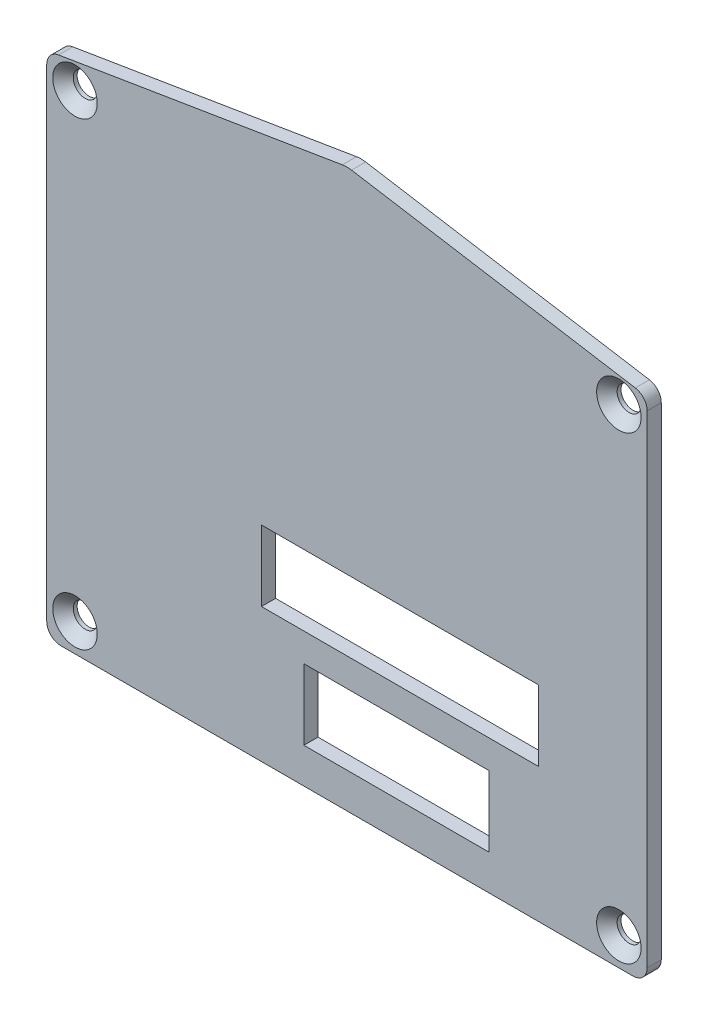
ISO-10303-21;
HEADER;
FILE_DESCRIPTION(('STEP AP214'),'2;1');
FILE_NAME('part.step','',(''),(''),'','','');
FILE_SCHEMA(('AUTOMOTIVE_DESIGN { 1 0 10303 214 1 1 1 1 }'));
ENDSEC;
DATA;
#1=APPLICATION_CONTEXT('core data for automotive mechanical design processes');
#2=APPLICATION_PROTOCOL_DEFINITION('international standard','automotive_design',2000,#1);
#3=PRODUCT_CONTEXT('',#1,'mechanical');
#4=PRODUCT('Part','Part','',(#3));
#5=PRODUCT_RELATED_PRODUCT_CATEGORY('part','',(#4));
#6=PRODUCT_DEFINITION_FORMATION('','',#4);
#7=PRODUCT_DEFINITION_CONTEXT('part definition',#1,'design');
#8=PRODUCT_DEFINITION('design','',#6,#7);
#9=PRODUCT_DEFINITION_SHAPE('','',#8);
#10=(LENGTH_UNIT() NAMED_UNIT(*) SI_UNIT(.MILLI.,.METRE.));
#11=(NAMED_UNIT(*) PLANE_ANGLE_UNIT() SI_UNIT($,.RADIAN.));
#12=(NAMED_UNIT(*) SI_UNIT($,.STERADIAN.) SOLID_ANGLE_UNIT());
#13=UNCERTAINTY_MEASURE_WITH_UNIT(LENGTH_MEASURE(1.E-05),#10,'distance_accuracy_value','');
#14=(GEOMETRIC_REPRESENTATION_CONTEXT(3) GLOBAL_UNCERTAINTY_ASSIGNED_CONTEXT((#13)) GLOBAL_UNIT_ASSIGNED_CONTEXT((#10,
#11,#12)) REPRESENTATION_CONTEXT('',''));
#15=CARTESIAN_POINT('',(0.,0.,0.));
#16=DIRECTION('',(0.,0.,1.));
#17=DIRECTION('',(1.,0.,0.));
#18=AXIS2_PLACEMENT_3D('',#15,#16,#17);
#19=CARTESIAN_POINT('',(-40.5,34.3024652654793,2.));
#20=DIRECTION('',(0.,0.,1.));
#21=DIRECTION('',(1.,0.,0.));
#22=AXIS2_PLACEMENT_3D('',#19,#20,#21);
#23=CYLINDRICAL_SURFACE('',#22,2.);
#24=DIRECTION('',(0.,0.,1.));
#25=VECTOR('',#24,1.);
#26=CARTESIAN_POINT('',(-40.8250325204258,36.2758769966357,2.));
#27=LINE('',#26,#25);
#28=CARTESIAN_POINT('',(-40.8250325204258,36.2758769966357,0.));
#29=VERTEX_POINT('',#28);
#30=CARTESIAN_POINT('',(-40.8250325204258,36.2758769966357,2.));
#31=VERTEX_POINT('',#30);
#32=EDGE_CURVE('E294',#29,#31,#27,.T.);
#33=ORIENTED_EDGE('',*,*,#32,.F.);
#34=CARTESIAN_POINT('',(-40.5,34.3024652654793,0.));
#35=DIRECTION('',(0.,0.,1.));
#36=DIRECTION('',(1.,0.,0.));
#37=AXIS2_PLACEMENT_3D('',#34,#35,#36);
#38=CIRCLE('',#37,2.);
#39=CARTESIAN_POINT('',(-42.5,34.3024652654793,0.));
#40=VERTEX_POINT('',#39);
#41=EDGE_CURVE('E42',#40,#29,#38,.F.);
#42=ORIENTED_EDGE('',*,*,#41,.F.);
#43=DIRECTION('',(0.,0.,1.));
#44=VECTOR('',#43,1.);
#45=CARTESIAN_POINT('',(-42.5,34.3024652654793,2.));
#46=LINE('',#45,#44);
#47=CARTESIAN_POINT('',(-42.5,34.3024652654793,2.));
#48=VERTEX_POINT('',#47);
#49=EDGE_CURVE('E297',#48,#40,#46,.F.);
#50=ORIENTED_EDGE('',*,*,#49,.F.);
#51=CARTESIAN_POINT('',(-40.5,34.3024652654793,2.));
#52=DIRECTION('',(0.,0.,1.));
#53=DIRECTION('',(1.,0.,0.));
#54=AXIS2_PLACEMENT_3D('',#51,#52,#53);
#55=CIRCLE('',#54,2.);
#56=EDGE_CURVE('E11',#31,#48,#55,.T.);
#57=ORIENTED_EDGE('',*,*,#56,.F.);
#58=EDGE_LOOP('',(#33,#42,#50,#57));
#59=FACE_BOUND('',#58,.T.);
#60=ADVANCED_FACE('F35',(#59),#23,.T.);
#61=CARTESIAN_POINT('',(-40.5,-34.,2.));
#62=DIRECTION('',(0.,0.,-1.));
#63=DIRECTION('',(-1.,0.,0.));
#64=AXIS2_PLACEMENT_3D('',#61,#62,#63);
#65=CYLINDRICAL_SURFACE('',#64,2.);
#66=DIRECTION('',(0.,0.,1.));
#67=VECTOR('',#66,1.);
#68=CARTESIAN_POINT('',(-42.5,-34.,2.));
#69=LINE('',#68,#67);
#70=CARTESIAN_POINT('',(-42.5,-34.,0.));
#71=VERTEX_POINT('',#70);
#72=CARTESIAN_POINT('',(-42.5,-34.,2.));
#73=VERTEX_POINT('',#72);
#74=EDGE_CURVE('E284',#71,#73,#69,.T.);
#75=ORIENTED_EDGE('',*,*,#74,.F.);
#76=CARTESIAN_POINT('',(-40.5,-34.,0.));
#77=DIRECTION('',(0.,0.,1.));
#78=DIRECTION('',(1.,0.,0.));
#79=AXIS2_PLACEMENT_3D('',#76,#77,#78);
#80=CIRCLE('',#79,2.);
#81=CARTESIAN_POINT('',(-40.5,-36.,0.));
#82=VERTEX_POINT('',#81);
#83=EDGE_CURVE('E290',#82,#71,#80,.F.);
#84=ORIENTED_EDGE('',*,*,#83,.F.);
#85=DIRECTION('',(0.,0.,1.));
#86=VECTOR('',#85,1.);
#87=CARTESIAN_POINT('',(-40.5,-36.,2.));
#88=LINE('',#87,#86);
#89=CARTESIAN_POINT('',(-40.5,-36.,2.));
#90=VERTEX_POINT('',#89);
#91=EDGE_CURVE('E287',#90,#82,#88,.F.);
#92=ORIENTED_EDGE('',*,*,#91,.F.);
#93=CARTESIAN_POINT('',(-40.5,-34.,2.));
#94=DIRECTION('',(0.,0.,1.));
#95=DIRECTION('',(1.,0.,0.));
#96=AXIS2_PLACEMENT_3D('',#93,#94,#95);
#97=CIRCLE('',#96,2.);
#98=EDGE_CURVE('E292',#73,#90,#97,.T.);
#99=ORIENTED_EDGE('',*,*,#98,.F.);
#100=EDGE_LOOP('',(#75,#84,#92,#99));
#101=FACE_BOUND('',#100,.T.);
#102=ADVANCED_FACE('F338',(#101),#65,.T.);
#103=CARTESIAN_POINT('',(40.5,-34.,2.));
#104=DIRECTION('',(0.,0.,-1.));
#105=DIRECTION('',(-1.,0.,0.));
#106=AXIS2_PLACEMENT_3D('',#103,#104,#105);
#107=CYLINDRICAL_SURFACE('',#106,2.);
#108=DIRECTION('',(0.,0.,-1.));
#109=VECTOR('',#108,1.);
#110=CARTESIAN_POINT('',(42.5,-34.,2.));
#111=LINE('',#110,#109);
#112=CARTESIAN_POINT('',(42.5,-34.,2.));
#113=VERTEX_POINT('',#112);
#114=CARTESIAN_POINT('',(42.5,-34.,0.));
#115=VERTEX_POINT('',#114);
#116=EDGE_CURVE('E273',#113,#115,#111,.T.);
#117=ORIENTED_EDGE('',*,*,#116,.F.);
#118=CARTESIAN_POINT('',(40.5,-34.,2.));
#119=DIRECTION('',(0.,0.,1.));
#120=DIRECTION('',(1.,0.,0.));
#121=AXIS2_PLACEMENT_3D('',#118,#119,#120);
#122=CIRCLE('',#121,2.);
#123=CARTESIAN_POINT('',(40.5,-36.,2.));
#124=VERTEX_POINT('',#123);
#125=EDGE_CURVE('E279',#124,#113,#122,.T.);
#126=ORIENTED_EDGE('',*,*,#125,.F.);
#127=DIRECTION('',(0.,0.,-1.));
#128=VECTOR('',#127,1.);
#129=CARTESIAN_POINT('',(40.5,-36.,2.));
#130=LINE('',#129,#128);
#131=CARTESIAN_POINT('',(40.5,-36.,0.));
#132=VERTEX_POINT('',#131);
#133=EDGE_CURVE('E276',#132,#124,#130,.F.);
#134=ORIENTED_EDGE('',*,*,#133,.F.);
#135=CARTESIAN_POINT('',(40.5,-34.,0.));
#136=DIRECTION('',(0.,0.,1.));
#137=DIRECTION('',(1.,0.,0.));
#138=AXIS2_PLACEMENT_3D('',#135,#136,#137);
#139=CIRCLE('',#138,2.);
#140=EDGE_CURVE('E281',#115,#132,#139,.F.);
#141=ORIENTED_EDGE('',*,*,#140,.F.);
#142=EDGE_LOOP('',(#117,#126,#134,#141));
#143=FACE_BOUND('',#142,.T.);
#144=ADVANCED_FACE('F331',(#143),#107,.T.);
#145=CARTESIAN_POINT('',(40.5,34.3024652654794,2.));
#146=DIRECTION('',(0.,0.,1.));
#147=DIRECTION('',(1.,0.,0.));
#148=AXIS2_PLACEMENT_3D('',#145,#146,#147);
#149=CYLINDRICAL_SURFACE('',#148,2.);
#150=DIRECTION('',(0.,0.,-1.));
#151=VECTOR('',#150,1.);
#152=CARTESIAN_POINT('',(40.8250325204258,36.2758769966358,2.));
#153=LINE('',#152,#151);
#154=CARTESIAN_POINT('',(40.8250325204258,36.2758769966358,2.));
#155=VERTEX_POINT('',#154);
#156=CARTESIAN_POINT('',(40.8250325204258,36.2758769966358,0.));
#157=VERTEX_POINT('',#156);
#158=EDGE_CURVE('E262',#155,#157,#153,.T.);
#159=ORIENTED_EDGE('',*,*,#158,.F.);
#160=CARTESIAN_POINT('',(40.5,34.3024652654794,2.));
#161=DIRECTION('',(0.,0.,1.));
#162=DIRECTION('',(1.,0.,0.));
#163=AXIS2_PLACEMENT_3D('',#160,#161,#162);
#164=CIRCLE('',#163,2.);
#165=CARTESIAN_POINT('',(42.5,34.3024652654794,2.));
#166=VERTEX_POINT('',#165);
#167=EDGE_CURVE('E268',#166,#155,#164,.T.);
#168=ORIENTED_EDGE('',*,*,#167,.F.);
#169=DIRECTION('',(0.,0.,-1.));
#170=VECTOR('',#169,1.);
#171=CARTESIAN_POINT('',(42.5,34.3024652654794,2.));
#172=LINE('',#171,#170);
#173=CARTESIAN_POINT('',(42.5,34.3024652654794,0.));
#174=VERTEX_POINT('',#173);
#175=EDGE_CURVE('E265',#174,#166,#172,.F.);
#176=ORIENTED_EDGE('',*,*,#175,.F.);
#177=CARTESIAN_POINT('',(40.5,34.3024652654794,0.));
#178=DIRECTION('',(0.,0.,1.));
#179=DIRECTION('',(1.,0.,0.));
#180=AXIS2_PLACEMENT_3D('',#177,#178,#179);
#181=CIRCLE('',#180,2.);
#182=EDGE_CURVE('E270',#157,#174,#181,.F.);
#183=ORIENTED_EDGE('',*,*,#182,.F.);
#184=EDGE_LOOP('',(#159,#168,#176,#183));
#185=FACE_BOUND('',#184,.T.);
#186=ADVANCED_FACE('F322',(#185),#149,.T.);
#187=CARTESIAN_POINT('',(0.,38.946107001547,2.));
#188=DIRECTION('',(0.,0.,1.));
#189=DIRECTION('',(1.,0.,0.));
#190=AXIS2_PLACEMENT_3D('',#187,#188,#189);
#191=CYLINDRICAL_SURFACE('',#190,4.);
#192=DIRECTION('',(0.,0.,1.));
#193=VECTOR('',#192,1.);
#194=CARTESIAN_POINT('',(0.650065040851534,42.8929304638597,2.));
#195=LINE('',#194,#193);
#196=CARTESIAN_POINT('',(0.650065040851547,42.8929304638597,0.));
#197=VERTEX_POINT('',#196);
#198=CARTESIAN_POINT('',(0.650065040851547,42.8929304638597,2.));
#199=VERTEX_POINT('',#198);
#200=EDGE_CURVE('E241',#197,#199,#195,.T.);
#201=ORIENTED_EDGE('',*,*,#200,.F.);
#202=CARTESIAN_POINT('',(0.,38.946107001547,0.));
#203=DIRECTION('',(0.,0.,1.));
#204=DIRECTION('',(1.,0.,0.));
#205=AXIS2_PLACEMENT_3D('',#202,#203,#204);
#206=CIRCLE('',#205,4.);
#207=CARTESIAN_POINT('',(-0.6500650408515,42.8929304638597,0.));
#208=VERTEX_POINT('',#207);
#209=EDGE_CURVE('E257',#208,#197,#206,.F.);
#210=ORIENTED_EDGE('',*,*,#209,.F.);
#211=DIRECTION('',(0.,0.,1.));
#212=VECTOR('',#211,1.);
#213=CARTESIAN_POINT('',(-0.650065040851502,42.8929304638597,2.));
#214=LINE('',#213,#212);
#215=CARTESIAN_POINT('',(-0.6500650408515,42.8929304638597,2.));
#216=VERTEX_POINT('',#215);
#217=EDGE_CURVE('E254',#216,#208,#214,.F.);
#218=ORIENTED_EDGE('',*,*,#217,.F.);
#219=CARTESIAN_POINT('',(0.,38.946107001547,2.));
#220=DIRECTION('',(0.,0.,1.));
#221=DIRECTION('',(1.,0.,0.));
#222=AXIS2_PLACEMENT_3D('',#219,#220,#221);
#223=CIRCLE('',#222,4.);
#224=EDGE_CURVE('E259',#199,#216,#223,.T.);
#225=ORIENTED_EDGE('',*,*,#224,.F.);
#226=EDGE_LOOP('',(#201,#210,#218,#225));
#227=FACE_BOUND('',#226,.T.);
#228=ADVANCED_FACE('F312',(#227),#191,.T.);
#229=CARTESIAN_POINT('',(0.,-36.,2.));
#230=DIRECTION('',(0.,1.,0.));
#231=DIRECTION('',(0.,0.,1.));
#232=AXIS2_PLACEMENT_3D('',#229,#230,#231);
#233=PLANE('',#232);
#234=DIRECTION('',(1.,0.,0.));
#235=VECTOR('',#234,1.);
#236=CARTESIAN_POINT('',(0.,-36.,2.));
#237=LINE('',#236,#235);
#238=EDGE_CURVE('E228',#90,#124,#237,.T.);
#239=ORIENTED_EDGE('',*,*,#238,.F.);
#240=ORIENTED_EDGE('',*,*,#91,.T.);
#241=DIRECTION('',(1.,0.,0.));
#242=VECTOR('',#241,1.);
#243=CARTESIAN_POINT('',(0.,-36.,0.));
#244=LINE('',#243,#242);
#245=EDGE_CURVE('E174',#82,#132,#244,.T.);
#246=ORIENTED_EDGE('',*,*,#245,.T.);
#247=ORIENTED_EDGE('',*,*,#133,.T.);
#248=EDGE_LOOP('',(#239,#240,#246,#247));
#249=FACE_BOUND('',#248,.T.);
#250=ADVANCED_FACE('F334',(#249),#233,.F.);
#251=CARTESIAN_POINT('',(42.5,0.,2.));
#252=DIRECTION('',(-1.,0.,0.));
#253=DIRECTION('',(0.,0.,1.));
#254=AXIS2_PLACEMENT_3D('',#251,#252,#253);
#255=PLANE('',#254);
#256=DIRECTION('',(0.,1.,0.));
#257=VECTOR('',#256,1.);
#258=CARTESIAN_POINT('',(42.5,0.,2.));
#259=LINE('',#258,#257);
#260=EDGE_CURVE('E230',#113,#166,#259,.T.);
#261=ORIENTED_EDGE('',*,*,#260,.F.);
#262=ORIENTED_EDGE('',*,*,#116,.T.);
#263=DIRECTION('',(0.,1.,0.));
#264=VECTOR('',#263,1.);
#265=CARTESIAN_POINT('',(42.5,0.,0.));
#266=LINE('',#265,#264);
#267=EDGE_CURVE('E243',#115,#174,#266,.T.);
#268=ORIENTED_EDGE('',*,*,#267,.T.);
#269=ORIENTED_EDGE('',*,*,#175,.T.);
#270=EDGE_LOOP('',(#261,#262,#268,#269));
#271=FACE_BOUND('',#270,.T.);
#272=ADVANCED_FACE('F325',(#271),#255,.F.);
#273=CARTESIAN_POINT('',(6.89529712976688,41.864304002156,2.));
#274=DIRECTION('',(0.16251626021288,0.986705865578197,0.));
#275=DIRECTION('',(-0.986705865578198,0.16251626021288,0.));
#276=AXIS2_PLACEMENT_3D('',#273,#274,#275);
#277=PLANE('',#276);
#278=DIRECTION('',(0.986705865578197,-0.16251626021288,0.));
#279=VECTOR('',#278,1.);
#280=CARTESIAN_POINT('',(6.89529712976688,41.864304002156,2.));
#281=LINE('',#280,#279);
#282=EDGE_CURVE('E233',#199,#155,#281,.T.);
#283=ORIENTED_EDGE('',*,*,#282,.T.);
#284=ORIENTED_EDGE('',*,*,#158,.T.);
#285=DIRECTION('',(0.986705865578197,-0.16251626021288,0.));
#286=VECTOR('',#285,1.);
#287=CARTESIAN_POINT('',(6.89529712976688,41.864304002156,0.));
#288=LINE('',#287,#286);
#289=EDGE_CURVE('E245',#197,#157,#288,.T.);
#290=ORIENTED_EDGE('',*,*,#289,.F.);
#291=ORIENTED_EDGE('',*,*,#200,.T.);
#292=EDGE_LOOP('',(#283,#284,#290,#291));
#293=FACE_BOUND('',#292,.T.);
#294=ADVANCED_FACE('F317',(#293),#277,.T.);
#295=CARTESIAN_POINT('',(-6.89529712976689,41.864304002156,2.));
#296=DIRECTION('',(-0.16251626021288,0.986705865578197,0.));
#297=DIRECTION('',(-0.986705865578198,-0.16251626021288,0.));
#298=AXIS2_PLACEMENT_3D('',#295,#296,#297);
#299=PLANE('',#298);
#300=DIRECTION('',(0.986705865578197,0.16251626021288,0.));
#301=VECTOR('',#300,1.);
#302=CARTESIAN_POINT('',(-6.89529712976689,41.864304002156,0.));
#303=LINE('',#302,#301);
#304=EDGE_CURVE('E248',#29,#208,#303,.T.);
#305=ORIENTED_EDGE('',*,*,#304,.F.);
#306=ORIENTED_EDGE('',*,*,#32,.T.);
#307=DIRECTION('',(0.986705865578197,0.16251626021288,0.));
#308=VECTOR('',#307,1.);
#309=CARTESIAN_POINT('',(-6.89529712976689,41.864304002156,2.));
#310=LINE('',#309,#308);
#311=EDGE_CURVE('E236',#31,#216,#310,.T.);
#312=ORIENTED_EDGE('',*,*,#311,.T.);
#313=ORIENTED_EDGE('',*,*,#217,.T.);
#314=EDGE_LOOP('',(#305,#306,#312,#313));
#315=FACE_BOUND('',#314,.T.);
#316=ADVANCED_FACE('F308',(#315),#299,.T.);
#317=CARTESIAN_POINT('',(-42.5,0.,2.));
#318=DIRECTION('',(-1.,0.,0.));
#319=DIRECTION('',(0.,0.,1.));
#320=AXIS2_PLACEMENT_3D('',#317,#318,#319);
#321=PLANE('',#320);
#322=DIRECTION('',(0.,1.,0.));
#323=VECTOR('',#322,1.);
#324=CARTESIAN_POINT('',(-42.5,0.,2.));
#325=LINE('',#324,#323);
#326=EDGE_CURVE('E238',#73,#48,#325,.T.);
#327=ORIENTED_EDGE('',*,*,#326,.T.);
#328=ORIENTED_EDGE('',*,*,#49,.T.);
#329=DIRECTION('',(0.,1.,0.));
#330=VECTOR('',#329,1.);
#331=CARTESIAN_POINT('',(-42.5,0.,0.));
#332=LINE('',#331,#330);
#333=EDGE_CURVE('E231',#71,#40,#332,.T.);
#334=ORIENTED_EDGE('',*,*,#333,.F.);
#335=ORIENTED_EDGE('',*,*,#74,.T.);
#336=EDGE_LOOP('',(#327,#328,#334,#335));
#337=FACE_BOUND('',#336,.T.);
#338=ADVANCED_FACE('F341',(#337),#321,.T.);
#339=CARTESIAN_POINT('',(0.,0.,2.));
#340=DIRECTION('',(0.,0.,1.));
#341=DIRECTION('',(1.,0.,0.));
#342=AXIS2_PLACEMENT_3D('',#339,#340,#341);
#343=PLANE('',#342);
#344=CARTESIAN_POINT('',(-38.5,33.0758769966357,2.));
#345=DIRECTION('',(0.,0.,1.));
#346=DIRECTION('',(1.,0.,0.));
#347=AXIS2_PLACEMENT_3D('',#344,#345,#346);
#348=CIRCLE('',#347,3.15);
#349=CARTESIAN_POINT('',(-35.35,33.0758769966357,2.));
#350=VERTEX_POINT('',#349);
#351=EDGE_CURVE('E562',#350,#350,#348,.T.);
#352=ORIENTED_EDGE('',*,*,#351,.F.);
#353=EDGE_LOOP('',(#352));
#354=FACE_BOUND('',#353,.T.);
#355=CARTESIAN_POINT('',(-38.5,-32.,2.));
#356=DIRECTION('',(0.,0.,1.));
#357=DIRECTION('',(1.,0.,0.));
#358=AXIS2_PLACEMENT_3D('',#355,#356,#357);
#359=CIRCLE('',#358,3.15);
#360=CARTESIAN_POINT('',(-35.35,-32.,2.));
#361=VERTEX_POINT('',#360);
#362=EDGE_CURVE('E569',#361,#361,#359,.T.);
#363=ORIENTED_EDGE('',*,*,#362,.F.);
#364=EDGE_LOOP('',(#363));
#365=FACE_BOUND('',#364,.T.);
#366=CARTESIAN_POINT('',(38.5,-32.,2.));
#367=DIRECTION('',(0.,0.,1.));
#368=DIRECTION('',(1.,0.,0.));
#369=AXIS2_PLACEMENT_3D('',#366,#367,#368);
#370=CIRCLE('',#369,3.15);
#371=CARTESIAN_POINT('',(41.65,-32.,2.));
#372=VERTEX_POINT('',#371);
#373=EDGE_CURVE('E578',#372,#372,#370,.T.);
#374=ORIENTED_EDGE('',*,*,#373,.F.);
#375=EDGE_LOOP('',(#374));
#376=FACE_BOUND('',#375,.T.);
#377=CARTESIAN_POINT('',(38.5,33.0758769966357,2.));
#378=DIRECTION('',(0.,0.,1.));
#379=DIRECTION('',(1.,0.,0.));
#380=AXIS2_PLACEMENT_3D('',#377,#378,#379);
#381=CIRCLE('',#380,3.15);
#382=CARTESIAN_POINT('',(41.65,33.0758769966357,2.));
#383=VERTEX_POINT('',#382);
#384=EDGE_CURVE('E587',#383,#383,#381,.T.);
#385=ORIENTED_EDGE('',*,*,#384,.F.);
#386=EDGE_LOOP('',(#385));
#387=FACE_BOUND('',#386,.T.);
#388=DIRECTION('',(0.,1.,0.));
#389=VECTOR('',#388,1.);
#390=CARTESIAN_POINT('',(27.1,-16.99,2.));
#391=LINE('',#390,#389);
#392=CARTESIAN_POINT('',(27.1,-16.99,2.));
#393=VERTEX_POINT('',#392);
#394=CARTESIAN_POINT('',(27.1,-6.98999999999999,2.));
#395=VERTEX_POINT('',#394);
#396=EDGE_CURVE('E49',#393,#395,#391,.T.);
#397=ORIENTED_EDGE('',*,*,#396,.F.);
#398=DIRECTION('',(1.,0.,0.));
#399=VECTOR('',#398,1.);
#400=CARTESIAN_POINT('',(-12.1,-16.99,2.));
#401=LINE('',#400,#399);
#402=CARTESIAN_POINT('',(-12.1,-16.99,2.));
#403=VERTEX_POINT('',#402);
#404=EDGE_CURVE('E166',#403,#393,#401,.T.);
#405=ORIENTED_EDGE('',*,*,#404,.F.);
#406=DIRECTION('',(0.,-1.,0.));
#407=VECTOR('',#406,1.);
#408=CARTESIAN_POINT('',(-12.1,-16.99,2.));
#409=LINE('',#408,#407);
#410=CARTESIAN_POINT('',(-12.1,-6.99000000000001,2.));
#411=VERTEX_POINT('',#410);
#412=EDGE_CURVE('E189',#411,#403,#409,.T.);
#413=ORIENTED_EDGE('',*,*,#412,.F.);
#414=DIRECTION('',(-1.,0.,0.));
#415=VECTOR('',#414,1.);
#416=CARTESIAN_POINT('',(-12.1,-6.99000000000001,2.));
#417=LINE('',#416,#415);
#418=EDGE_CURVE('E182',#395,#411,#417,.T.);
#419=ORIENTED_EDGE('',*,*,#418,.F.);
#420=EDGE_LOOP('',(#397,#405,#413,#419));
#421=FACE_BOUND('',#420,.T.);
#422=DIRECTION('',(0.,1.,0.));
#423=VECTOR('',#422,1.);
#424=CARTESIAN_POINT('',(20.1,-31.,2.));
#425=LINE('',#424,#423);
#426=CARTESIAN_POINT('',(20.1,-31.,2.));
#427=VERTEX_POINT('',#426);
#428=CARTESIAN_POINT('',(20.1,-21.,2.));
#429=VERTEX_POINT('',#428);
#430=EDGE_CURVE('E57',#427,#429,#425,.T.);
#431=ORIENTED_EDGE('',*,*,#430,.F.);
#432=DIRECTION('',(1.,0.,0.));
#433=VECTOR('',#432,1.);
#434=CARTESIAN_POINT('',(-6.09999999999998,-31.,2.));
#435=LINE('',#434,#433);
#436=CARTESIAN_POINT('',(-6.09999999999998,-31.,2.));
#437=VERTEX_POINT('',#436);
#438=EDGE_CURVE('E214',#437,#427,#435,.T.);
#439=ORIENTED_EDGE('',*,*,#438,.F.);
#440=DIRECTION('',(0.,-1.,0.));
#441=VECTOR('',#440,1.);
#442=CARTESIAN_POINT('',(-6.09999999999998,-31.,2.));
#443=LINE('',#442,#441);
#444=CARTESIAN_POINT('',(-6.09999999999998,-21.,2.));
#445=VERTEX_POINT('',#444);
#446=EDGE_CURVE('E211',#445,#437,#443,.T.);
#447=ORIENTED_EDGE('',*,*,#446,.F.);
#448=DIRECTION('',(-1.,0.,0.));
#449=VECTOR('',#448,1.);
#450=CARTESIAN_POINT('',(-6.09999999999998,-21.,2.));
#451=LINE('',#450,#449);
#452=EDGE_CURVE('E208',#429,#445,#451,.T.);
#453=ORIENTED_EDGE('',*,*,#452,.F.);
#454=EDGE_LOOP('',(#431,#439,#447,#453));
#455=FACE_BOUND('',#454,.T.);
#456=ORIENTED_EDGE('',*,*,#311,.F.);
#457=ORIENTED_EDGE('',*,*,#56,.T.);
#458=ORIENTED_EDGE('',*,*,#326,.F.);
#459=ORIENTED_EDGE('',*,*,#98,.T.);
#460=ORIENTED_EDGE('',*,*,#238,.T.);
#461=ORIENTED_EDGE('',*,*,#125,.T.);
#462=ORIENTED_EDGE('',*,*,#260,.T.);
#463=ORIENTED_EDGE('',*,*,#167,.T.);
#464=ORIENTED_EDGE('',*,*,#282,.F.);
#465=ORIENTED_EDGE('',*,*,#224,.T.);
#466=EDGE_LOOP('',(#456,#457,#458,#459,#460,#461,#462,#463,#464,#465));
#467=FACE_BOUND('',#466,.T.);
#468=ADVANCED_FACE('F343',(#354,#365,#376,#387,#421,#455,#467),#343,.T.);
#469=CARTESIAN_POINT('',(0.,0.,0.));
#470=DIRECTION('',(0.,0.,1.));
#471=DIRECTION('',(1.,0.,0.));
#472=AXIS2_PLACEMENT_3D('',#469,#470,#471);
#473=PLANE('',#472);
#474=CARTESIAN_POINT('',(-38.5,33.0758769966357,0.));
#475=DIRECTION('',(0.,0.,1.));
#476=DIRECTION('',(1.,0.,0.));
#477=AXIS2_PLACEMENT_3D('',#474,#475,#476);
#478=CIRCLE('',#477,1.7);
#479=CARTESIAN_POINT('',(-36.8,33.0758769966357,0.));
#480=VERTEX_POINT('',#479);
#481=EDGE_CURVE('E564',#480,#480,#478,.T.);
#482=ORIENTED_EDGE('',*,*,#481,.T.);
#483=EDGE_LOOP('',(#482));
#484=FACE_BOUND('',#483,.T.);
#485=CARTESIAN_POINT('',(-38.5,-32.,0.));
#486=DIRECTION('',(0.,0.,1.));
#487=DIRECTION('',(1.,0.,0.));
#488=AXIS2_PLACEMENT_3D('',#485,#486,#487);
#489=CIRCLE('',#488,1.7);
#490=CARTESIAN_POINT('',(-36.8,-32.,0.));
#491=VERTEX_POINT('',#490);
#492=EDGE_CURVE('E575',#491,#491,#489,.T.);
#493=ORIENTED_EDGE('',*,*,#492,.T.);
#494=EDGE_LOOP('',(#493));
#495=FACE_BOUND('',#494,.T.);
#496=CARTESIAN_POINT('',(38.5,-32.,0.));
#497=DIRECTION('',(0.,0.,1.));
#498=DIRECTION('',(1.,0.,0.));
#499=AXIS2_PLACEMENT_3D('',#496,#497,#498);
#500=CIRCLE('',#499,1.7);
#501=CARTESIAN_POINT('',(40.2,-32.,0.));
#502=VERTEX_POINT('',#501);
#503=EDGE_CURVE('E584',#502,#502,#500,.T.);
#504=ORIENTED_EDGE('',*,*,#503,.T.);
#505=EDGE_LOOP('',(#504));
#506=FACE_BOUND('',#505,.T.);
#507=CARTESIAN_POINT('',(38.5,33.0758769966357,0.));
#508=DIRECTION('',(0.,0.,1.));
#509=DIRECTION('',(1.,0.,0.));
#510=AXIS2_PLACEMENT_3D('',#507,#508,#509);
#511=CIRCLE('',#510,1.7);
#512=CARTESIAN_POINT('',(40.2,33.0758769966357,0.));
#513=VERTEX_POINT('',#512);
#514=EDGE_CURVE('E201',#513,#513,#511,.T.);
#515=ORIENTED_EDGE('',*,*,#514,.T.);
#516=EDGE_LOOP('',(#515));
#517=FACE_BOUND('',#516,.T.);
#518=DIRECTION('',(-1.,0.,0.));
#519=VECTOR('',#518,1.);
#520=CARTESIAN_POINT('',(-12.1,-16.99,0.));
#521=LINE('',#520,#519);
#522=CARTESIAN_POINT('',(27.1,-16.99,0.));
#523=VERTEX_POINT('',#522);
#524=CARTESIAN_POINT('',(-12.1,-16.99,0.));
#525=VERTEX_POINT('',#524);
#526=EDGE_CURVE('E180',#523,#525,#521,.T.);
#527=ORIENTED_EDGE('',*,*,#526,.F.);
#528=DIRECTION('',(0.,-1.,0.));
#529=VECTOR('',#528,1.);
#530=CARTESIAN_POINT('',(27.1,-16.99,0.));
#531=LINE('',#530,#529);
#532=CARTESIAN_POINT('',(27.1,-6.98999999999999,0.));
#533=VERTEX_POINT('',#532);
#534=EDGE_CURVE('E160',#533,#523,#531,.T.);
#535=ORIENTED_EDGE('',*,*,#534,.F.);
#536=DIRECTION('',(1.,0.,0.));
#537=VECTOR('',#536,1.);
#538=CARTESIAN_POINT('',(-12.1,-6.99000000000001,0.));
#539=LINE('',#538,#537);
#540=CARTESIAN_POINT('',(-12.1,-6.99000000000001,0.));
#541=VERTEX_POINT('',#540);
#542=EDGE_CURVE('E170',#541,#533,#539,.T.);
#543=ORIENTED_EDGE('',*,*,#542,.F.);
#544=DIRECTION('',(0.,1.,0.));
#545=VECTOR('',#544,1.);
#546=CARTESIAN_POINT('',(-12.1,-16.99,0.));
#547=LINE('',#546,#545);
#548=EDGE_CURVE('E184',#525,#541,#547,.T.);
#549=ORIENTED_EDGE('',*,*,#548,.F.);
#550=EDGE_LOOP('',(#527,#535,#543,#549));
#551=FACE_BOUND('',#550,.T.);
#552=DIRECTION('',(-1.,0.,0.));
#553=VECTOR('',#552,1.);
#554=CARTESIAN_POINT('',(-6.09999999999998,-31.,0.));
#555=LINE('',#554,#553);
#556=CARTESIAN_POINT('',(20.1,-31.,0.));
#557=VERTEX_POINT('',#556);
#558=CARTESIAN_POINT('',(-6.09999999999998,-31.,0.));
#559=VERTEX_POINT('',#558);
#560=EDGE_CURVE('E200',#557,#559,#555,.T.);
#561=ORIENTED_EDGE('',*,*,#560,.F.);
#562=DIRECTION('',(0.,-1.,0.));
#563=VECTOR('',#562,1.);
#564=CARTESIAN_POINT('',(20.1,-31.,0.));
#565=LINE('',#564,#563);
#566=CARTESIAN_POINT('',(20.1,-21.,0.));
#567=VERTEX_POINT('',#566);
#568=EDGE_CURVE('E204',#567,#557,#565,.T.);
#569=ORIENTED_EDGE('',*,*,#568,.F.);
#570=DIRECTION('',(1.,0.,0.));
#571=VECTOR('',#570,1.);
#572=CARTESIAN_POINT('',(-6.09999999999998,-21.,0.));
#573=LINE('',#572,#571);
#574=CARTESIAN_POINT('',(-6.09999999999998,-21.,0.));
#575=VERTEX_POINT('',#574);
#576=EDGE_CURVE('E220',#575,#567,#573,.T.);
#577=ORIENTED_EDGE('',*,*,#576,.F.);
#578=DIRECTION('',(0.,1.,0.));
#579=VECTOR('',#578,1.);
#580=CARTESIAN_POINT('',(-6.09999999999998,-31.,0.));
#581=LINE('',#580,#579);
#582=EDGE_CURVE('E198',#559,#575,#581,.T.);
#583=ORIENTED_EDGE('',*,*,#582,.F.);
#584=EDGE_LOOP('',(#561,#569,#577,#583));
#585=FACE_BOUND('',#584,.T.);
#586=ORIENTED_EDGE('',*,*,#333,.T.);
#587=ORIENTED_EDGE('',*,*,#41,.T.);
#588=ORIENTED_EDGE('',*,*,#304,.T.);
#589=ORIENTED_EDGE('',*,*,#209,.T.);
#590=ORIENTED_EDGE('',*,*,#289,.T.);
#591=ORIENTED_EDGE('',*,*,#182,.T.);
#592=ORIENTED_EDGE('',*,*,#267,.F.);
#593=ORIENTED_EDGE('',*,*,#140,.T.);
#594=ORIENTED_EDGE('',*,*,#245,.F.);
#595=ORIENTED_EDGE('',*,*,#83,.T.);
#596=EDGE_LOOP('',(#586,#587,#588,#589,#590,#591,#592,#593,#594,#595));
#597=FACE_BOUND('',#596,.T.);
#598=ADVANCED_FACE('F177',(#484,#495,#506,#517,#551,#585,#597),#473,.F.);
#599=CARTESIAN_POINT('',(20.1,-31.,-0.00100000000000013));
#600=DIRECTION('',(1.,0.,0.));
#601=DIRECTION('',(0.,1.,0.));
#602=AXIS2_PLACEMENT_3D('',#599,#600,#601);
#603=PLANE('',#602);
#604=ORIENTED_EDGE('',*,*,#568,.T.);
#605=DIRECTION('',(0.,0.,1.));
#606=VECTOR('',#605,1.);
#607=CARTESIAN_POINT('',(20.1,-31.,-0.00100000000000013));
#608=LINE('',#607,#606);
#609=EDGE_CURVE('E218',#557,#427,#608,.T.);
#610=ORIENTED_EDGE('',*,*,#609,.T.);
#611=ORIENTED_EDGE('',*,*,#430,.T.);
#612=DIRECTION('',(0.,0.,1.));
#613=VECTOR('',#612,1.);
#614=CARTESIAN_POINT('',(20.1,-21.,-0.00100000000000013));
#615=LINE('',#614,#613);
#616=EDGE_CURVE('E217',#567,#429,#615,.T.);
#617=ORIENTED_EDGE('',*,*,#616,.F.);
#618=EDGE_LOOP('',(#604,#610,#611,#617));
#619=FACE_BOUND('',#618,.T.);
#620=ADVANCED_FACE('F351',(#619),#603,.F.);
#621=CARTESIAN_POINT('',(-6.09999999999998,-31.,-0.00100000000000013));
#622=DIRECTION('',(0.,-1.,0.));
#623=DIRECTION('',(0.,0.,-1.));
#624=AXIS2_PLACEMENT_3D('',#621,#622,#623);
#625=PLANE('',#624);
#626=ORIENTED_EDGE('',*,*,#560,.T.);
#627=DIRECTION('',(0.,0.,1.));
#628=VECTOR('',#627,1.);
#629=CARTESIAN_POINT('',(-6.09999999999998,-31.,-0.00100000000000013));
#630=LINE('',#629,#628);
#631=EDGE_CURVE('E221',#559,#437,#630,.T.);
#632=ORIENTED_EDGE('',*,*,#631,.T.);
#633=ORIENTED_EDGE('',*,*,#438,.T.);
#634=ORIENTED_EDGE('',*,*,#609,.F.);
#635=EDGE_LOOP('',(#626,#632,#633,#634));
#636=FACE_BOUND('',#635,.T.);
#637=ADVANCED_FACE('F396',(#636),#625,.F.);
#638=CARTESIAN_POINT('',(-6.09999999999998,-31.,-0.00100000000000013));
#639=DIRECTION('',(-1.,0.,0.));
#640=DIRECTION('',(0.,-1.,0.));
#641=AXIS2_PLACEMENT_3D('',#638,#639,#640);
#642=PLANE('',#641);
#643=ORIENTED_EDGE('',*,*,#582,.T.);
#644=DIRECTION('',(0.,0.,1.));
#645=VECTOR('',#644,1.);
#646=CARTESIAN_POINT('',(-6.09999999999998,-21.,-0.00100000000000013));
#647=LINE('',#646,#645);
#648=EDGE_CURVE('E223',#575,#445,#647,.T.);
#649=ORIENTED_EDGE('',*,*,#648,.T.);
#650=ORIENTED_EDGE('',*,*,#446,.T.);
#651=ORIENTED_EDGE('',*,*,#631,.F.);
#652=EDGE_LOOP('',(#643,#649,#650,#651));
#653=FACE_BOUND('',#652,.T.);
#654=ADVANCED_FACE('F405',(#653),#642,.F.);
#655=CARTESIAN_POINT('',(-6.09999999999998,-21.,-0.00100000000000013));
#656=DIRECTION('',(0.,1.,0.));
#657=DIRECTION('',(-1.,0.,0.));
#658=AXIS2_PLACEMENT_3D('',#655,#656,#657);
#659=PLANE('',#658);
#660=ORIENTED_EDGE('',*,*,#576,.T.);
#661=ORIENTED_EDGE('',*,*,#616,.T.);
#662=ORIENTED_EDGE('',*,*,#452,.T.);
#663=ORIENTED_EDGE('',*,*,#648,.F.);
#664=EDGE_LOOP('',(#660,#661,#662,#663));
#665=FACE_BOUND('',#664,.T.);
#666=ADVANCED_FACE('F415',(#665),#659,.F.);
#667=CARTESIAN_POINT('',(27.1,-16.99,-0.00100000000000013));
#668=DIRECTION('',(1.,0.,0.));
#669=DIRECTION('',(0.,1.,0.));
#670=AXIS2_PLACEMENT_3D('',#667,#668,#669);
#671=PLANE('',#670);
#672=ORIENTED_EDGE('',*,*,#534,.T.);
#673=DIRECTION('',(0.,0.,1.));
#674=VECTOR('',#673,1.);
#675=CARTESIAN_POINT('',(27.1,-16.99,-0.00100000000000013));
#676=LINE('',#675,#674);
#677=EDGE_CURVE('E175',#523,#393,#676,.T.);
#678=ORIENTED_EDGE('',*,*,#677,.T.);
#679=ORIENTED_EDGE('',*,*,#396,.T.);
#680=DIRECTION('',(0.,0.,1.));
#681=VECTOR('',#680,1.);
#682=CARTESIAN_POINT('',(27.1,-6.98999999999999,-0.00100000000000013));
#683=LINE('',#682,#681);
#684=EDGE_CURVE('E156',#533,#395,#683,.T.);
#685=ORIENTED_EDGE('',*,*,#684,.F.);
#686=EDGE_LOOP('',(#672,#678,#679,#685));
#687=FACE_BOUND('',#686,.T.);
#688=ADVANCED_FACE('F158',(#687),#671,.F.);
#689=CARTESIAN_POINT('',(-12.1,-16.99,-0.00100000000000013));
#690=DIRECTION('',(0.,-1.,0.));
#691=DIRECTION('',(0.,0.,-1.));
#692=AXIS2_PLACEMENT_3D('',#689,#690,#691);
#693=PLANE('',#692);
#694=ORIENTED_EDGE('',*,*,#526,.T.);
#695=DIRECTION('',(0.,0.,1.));
#696=VECTOR('',#695,1.);
#697=CARTESIAN_POINT('',(-12.1,-16.99,-0.00100000000000013));
#698=LINE('',#697,#696);
#699=EDGE_CURVE('E195',#525,#403,#698,.T.);
#700=ORIENTED_EDGE('',*,*,#699,.T.);
#701=ORIENTED_EDGE('',*,*,#404,.T.);
#702=ORIENTED_EDGE('',*,*,#677,.F.);
#703=EDGE_LOOP('',(#694,#700,#701,#702));
#704=FACE_BOUND('',#703,.T.);
#705=ADVANCED_FACE('F434',(#704),#693,.F.);
#706=CARTESIAN_POINT('',(-12.1,-16.99,-0.00100000000000013));
#707=DIRECTION('',(-1.,0.,0.));
#708=DIRECTION('',(0.,-1.,0.));
#709=AXIS2_PLACEMENT_3D('',#706,#707,#708);
#710=PLANE('',#709);
#711=ORIENTED_EDGE('',*,*,#548,.T.);
#712=DIRECTION('',(0.,0.,1.));
#713=VECTOR('',#712,1.);
#714=CARTESIAN_POINT('',(-12.1,-6.99000000000001,-0.00100000000000013));
#715=LINE('',#714,#713);
#716=EDGE_CURVE('E165',#541,#411,#715,.T.);
#717=ORIENTED_EDGE('',*,*,#716,.T.);
#718=ORIENTED_EDGE('',*,*,#412,.T.);
#719=ORIENTED_EDGE('',*,*,#699,.F.);
#720=EDGE_LOOP('',(#711,#717,#718,#719));
#721=FACE_BOUND('',#720,.T.);
#722=ADVANCED_FACE('F443',(#721),#710,.F.);
#723=CARTESIAN_POINT('',(-12.1,-6.99000000000001,-0.00100000000000013));
#724=DIRECTION('',(0.,1.,0.));
#725=DIRECTION('',(-1.,0.,0.));
#726=AXIS2_PLACEMENT_3D('',#723,#724,#725);
#727=PLANE('',#726);
#728=ORIENTED_EDGE('',*,*,#542,.T.);
#729=ORIENTED_EDGE('',*,*,#684,.T.);
#730=ORIENTED_EDGE('',*,*,#418,.T.);
#731=ORIENTED_EDGE('',*,*,#716,.F.);
#732=EDGE_LOOP('',(#728,#729,#730,#731));
#733=FACE_BOUND('',#732,.T.);
#734=ADVANCED_FACE('F171',(#733),#727,.F.);
#735=CARTESIAN_POINT('',(38.5,33.0758769966357,2.));
#736=DIRECTION('',(0.,0.,1.));
#737=DIRECTION('',(1.,0.,0.));
#738=AXIS2_PLACEMENT_3D('',#735,#736,#737);
#739=CYLINDRICAL_SURFACE('',#738,1.7);
#740=ORIENTED_EDGE('',*,*,#514,.F.);
#741=EDGE_LOOP('',(#740));
#742=FACE_BOUND('',#741,.T.);
#743=CARTESIAN_POINT('',(38.5,33.0758769966357,0.550000000000001));
#744=DIRECTION('',(0.,0.,1.));
#745=DIRECTION('',(1.,0.,0.));
#746=AXIS2_PLACEMENT_3D('',#743,#744,#745);
#747=CIRCLE('',#746,1.7);
#748=CARTESIAN_POINT('',(40.2,33.0758769966357,0.550000000000001));
#749=VERTEX_POINT('',#748);
#750=EDGE_CURVE('E590',#749,#749,#747,.T.);
#751=ORIENTED_EDGE('',*,*,#750,.T.);
#752=EDGE_LOOP('',(#751));
#753=FACE_BOUND('',#752,.T.);
#754=ADVANCED_FACE('F461',(#742,#753),#739,.F.);
#755=CARTESIAN_POINT('',(38.5,33.0758769966357,2.));
#756=DIRECTION('',(0.,0.,1.));
#757=DIRECTION('',(1.,0.,0.));
#758=AXIS2_PLACEMENT_3D('',#755,#756,#757);
#759=CONICAL_SURFACE('',#758,3.15,0.785398163397449);
#760=ORIENTED_EDGE('',*,*,#750,.F.);
#761=EDGE_LOOP('',(#760));
#762=FACE_BOUND('',#761,.T.);
#763=ORIENTED_EDGE('',*,*,#384,.T.);
#764=EDGE_LOOP('',(#763));
#765=FACE_BOUND('',#764,.T.);
#766=ADVANCED_FACE('F483',(#762,#765),#759,.F.);
#767=CARTESIAN_POINT('',(38.5,-32.,2.));
#768=DIRECTION('',(0.,0.,1.));
#769=DIRECTION('',(1.,0.,0.));
#770=AXIS2_PLACEMENT_3D('',#767,#768,#769);
#771=CYLINDRICAL_SURFACE('',#770,1.7);
#772=ORIENTED_EDGE('',*,*,#503,.F.);
#773=EDGE_LOOP('',(#772));
#774=FACE_BOUND('',#773,.T.);
#775=CARTESIAN_POINT('',(38.5,-32.,0.550000000000001));
#776=DIRECTION('',(0.,0.,1.));
#777=DIRECTION('',(1.,0.,0.));
#778=AXIS2_PLACEMENT_3D('',#775,#776,#777);
#779=CIRCLE('',#778,1.7);
#780=CARTESIAN_POINT('',(40.2,-32.,0.550000000000001));
#781=VERTEX_POINT('',#780);
#782=EDGE_CURVE('E581',#781,#781,#779,.T.);
#783=ORIENTED_EDGE('',*,*,#782,.T.);
#784=EDGE_LOOP('',(#783));
#785=FACE_BOUND('',#784,.T.);
#786=ADVANCED_FACE('F493',(#774,#785),#771,.F.);
#787=CARTESIAN_POINT('',(38.5,-32.,2.));
#788=DIRECTION('',(0.,0.,1.));
#789=DIRECTION('',(1.,0.,0.));
#790=AXIS2_PLACEMENT_3D('',#787,#788,#789);
#791=CONICAL_SURFACE('',#790,3.15,0.785398163397449);
#792=ORIENTED_EDGE('',*,*,#782,.F.);
#793=EDGE_LOOP('',(#792));
#794=FACE_BOUND('',#793,.T.);
#795=ORIENTED_EDGE('',*,*,#373,.T.);
#796=EDGE_LOOP('',(#795));
#797=FACE_BOUND('',#796,.T.);
#798=ADVANCED_FACE('F503',(#794,#797),#791,.F.);
#799=CARTESIAN_POINT('',(-38.5,-32.,2.));
#800=DIRECTION('',(0.,0.,1.));
#801=DIRECTION('',(1.,0.,0.));
#802=AXIS2_PLACEMENT_3D('',#799,#800,#801);
#803=CYLINDRICAL_SURFACE('',#802,1.7);
#804=ORIENTED_EDGE('',*,*,#492,.F.);
#805=EDGE_LOOP('',(#804));
#806=FACE_BOUND('',#805,.T.);
#807=CARTESIAN_POINT('',(-38.5,-32.,0.550000000000001));
#808=DIRECTION('',(0.,0.,1.));
#809=DIRECTION('',(1.,0.,0.));
#810=AXIS2_PLACEMENT_3D('',#807,#808,#809);
#811=CIRCLE('',#810,1.7);
#812=CARTESIAN_POINT('',(-36.8,-32.,0.550000000000001));
#813=VERTEX_POINT('',#812);
#814=EDGE_CURVE('E572',#813,#813,#811,.T.);
#815=ORIENTED_EDGE('',*,*,#814,.T.);
#816=EDGE_LOOP('',(#815));
#817=FACE_BOUND('',#816,.T.);
#818=ADVANCED_FACE('F513',(#806,#817),#803,.F.);
#819=CARTESIAN_POINT('',(-38.5,-32.,2.));
#820=DIRECTION('',(0.,0.,1.));
#821=DIRECTION('',(1.,0.,0.));
#822=AXIS2_PLACEMENT_3D('',#819,#820,#821);
#823=CONICAL_SURFACE('',#822,3.15,0.785398163397449);
#824=ORIENTED_EDGE('',*,*,#814,.F.);
#825=EDGE_LOOP('',(#824));
#826=FACE_BOUND('',#825,.T.);
#827=ORIENTED_EDGE('',*,*,#362,.T.);
#828=EDGE_LOOP('',(#827));
#829=FACE_BOUND('',#828,.T.);
#830=ADVANCED_FACE('F523',(#826,#829),#823,.F.);
#831=CARTESIAN_POINT('',(-38.5,33.0758769966357,2.));
#832=DIRECTION('',(0.,0.,1.));
#833=DIRECTION('',(1.,0.,0.));
#834=AXIS2_PLACEMENT_3D('',#831,#832,#833);
#835=CYLINDRICAL_SURFACE('',#834,1.7);
#836=ORIENTED_EDGE('',*,*,#481,.F.);
#837=EDGE_LOOP('',(#836));
#838=FACE_BOUND('',#837,.T.);
#839=CARTESIAN_POINT('',(-38.5,33.0758769966357,0.550000000000001));
#840=DIRECTION('',(0.,0.,1.));
#841=DIRECTION('',(1.,0.,0.));
#842=AXIS2_PLACEMENT_3D('',#839,#840,#841);
#843=CIRCLE('',#842,1.7);
#844=CARTESIAN_POINT('',(-36.8,33.0758769966357,0.550000000000001));
#845=VERTEX_POINT('',#844);
#846=EDGE_CURVE('E560',#845,#845,#843,.T.);
#847=ORIENTED_EDGE('',*,*,#846,.T.);
#848=EDGE_LOOP('',(#847));
#849=FACE_BOUND('',#848,.T.);
#850=ADVANCED_FACE('F533',(#838,#849),#835,.F.);
#851=CARTESIAN_POINT('',(-38.5,33.0758769966357,2.));
#852=DIRECTION('',(0.,0.,1.));
#853=DIRECTION('',(1.,0.,0.));
#854=AXIS2_PLACEMENT_3D('',#851,#852,#853);
#855=CONICAL_SURFACE('',#854,3.15,0.785398163397449);
#856=ORIENTED_EDGE('',*,*,#846,.F.);
#857=EDGE_LOOP('',(#856));
#858=FACE_BOUND('',#857,.T.);
#859=ORIENTED_EDGE('',*,*,#351,.T.);
#860=EDGE_LOOP('',(#859));
#861=FACE_BOUND('',#860,.T.);
#862=ADVANCED_FACE('F543',(#858,#861),#855,.F.);
#863=CLOSED_SHELL('',(#60,#102,#144,#186,#228,#250,#272,#294,#316,#338,#468,#598,#620,#637,#654,
#666,#688,#705,#722,#734,#754,#766,#786,#798,#818,#830,#850,#862));
#864=MANIFOLD_SOLID_BREP('B2',#863);
#865=ADVANCED_BREP_SHAPE_REPRESENTATION('',(#18,#864),#14);
#866=SHAPE_DEFINITION_REPRESENTATION(#9,#865);
ENDSEC;
END-ISO-10303-21;
